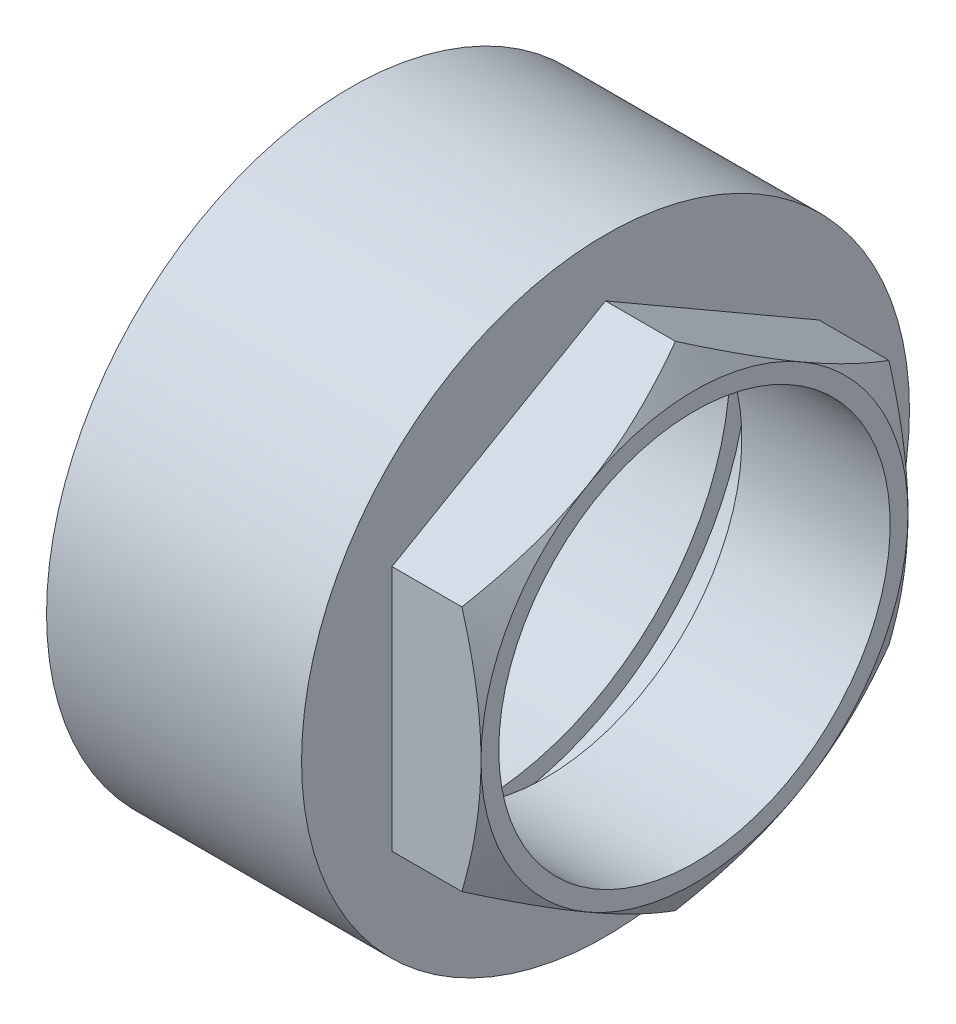
ISO-10303-21;
HEADER;
FILE_DESCRIPTION(('STEP AP214'),'2;1');
FILE_NAME('part.step','',(''),(''),'','','');
FILE_SCHEMA(('AUTOMOTIVE_DESIGN { 1 0 10303 214 1 1 1 1 }'));
ENDSEC;
DATA;
#1=APPLICATION_CONTEXT('core data for automotive mechanical design processes');
#2=APPLICATION_PROTOCOL_DEFINITION('international standard','automotive_design',2000,#1);
#3=PRODUCT_CONTEXT('',#1,'mechanical');
#4=PRODUCT('Part','Part','',(#3));
#5=PRODUCT_RELATED_PRODUCT_CATEGORY('part','',(#4));
#6=PRODUCT_DEFINITION_FORMATION('','',#4);
#7=PRODUCT_DEFINITION_CONTEXT('part definition',#1,'design');
#8=PRODUCT_DEFINITION('design','',#6,#7);
#9=PRODUCT_DEFINITION_SHAPE('','',#8);
#10=(LENGTH_UNIT() NAMED_UNIT(*) SI_UNIT(.MILLI.,.METRE.));
#11=(NAMED_UNIT(*) PLANE_ANGLE_UNIT() SI_UNIT($,.RADIAN.));
#12=(NAMED_UNIT(*) SI_UNIT($,.STERADIAN.) SOLID_ANGLE_UNIT());
#13=UNCERTAINTY_MEASURE_WITH_UNIT(LENGTH_MEASURE(1.E-05),#10,'distance_accuracy_value','');
#14=(GEOMETRIC_REPRESENTATION_CONTEXT(3) GLOBAL_UNCERTAINTY_ASSIGNED_CONTEXT((#13)) GLOBAL_UNIT_ASSIGNED_CONTEXT((#10,
#11,#12)) REPRESENTATION_CONTEXT('',''));
#15=CARTESIAN_POINT('',(0.,0.,0.));
#16=DIRECTION('',(0.,0.,1.));
#17=DIRECTION('',(1.,0.,0.));
#18=AXIS2_PLACEMENT_3D('',#15,#16,#17);
#19=CARTESIAN_POINT('',(0.,0.,0.));
#20=DIRECTION('',(1.,0.,0.));
#21=DIRECTION('',(0.,0.,-1.));
#22=AXIS2_PLACEMENT_3D('',#19,#20,#21);
#23=PLANE('',#22);
#24=CARTESIAN_POINT('',(0.,0.,0.));
#25=DIRECTION('',(1.,0.,0.));
#26=DIRECTION('',(0.,0.,-1.));
#27=AXIS2_PLACEMENT_3D('',#24,#25,#26);
#28=CIRCLE('',#27,25.625);
#29=CARTESIAN_POINT('',(0.,0.,-25.625));
#30=VERTEX_POINT('',#29);
#31=EDGE_CURVE('E133',#30,#30,#28,.T.);
#32=ORIENTED_EDGE('',*,*,#31,.F.);
#33=EDGE_LOOP('',(#32));
#34=FACE_BOUND('',#33,.T.);
#35=CARTESIAN_POINT('',(0.,0.,0.));
#36=DIRECTION('',(-1.,0.,0.));
#37=DIRECTION('',(0.,0.,1.));
#38=AXIS2_PLACEMENT_3D('',#35,#36,#37);
#39=CIRCLE('',#38,21.5);
#40=CARTESIAN_POINT('',(0.,0.,21.5));
#41=VERTEX_POINT('',#40);
#42=EDGE_CURVE('E150',#41,#41,#39,.T.);
#43=ORIENTED_EDGE('',*,*,#42,.F.);
#44=EDGE_LOOP('',(#43));
#45=FACE_BOUND('',#44,.T.);
#46=ADVANCED_FACE('F30',(#34,#45),#23,.F.);
#47=CARTESIAN_POINT('',(29.,20.7846096908265,0.));
#48=DIRECTION('',(1.,0.,0.));
#49=DIRECTION('',(0.,0.,-1.));
#50=AXIS2_PLACEMENT_3D('',#47,#48,#49);
#51=PLANE('',#50);
#52=CARTESIAN_POINT('',(29.,0.,0.));
#53=DIRECTION('',(1.,0.,0.));
#54=DIRECTION('',(0.,0.,-1.));
#55=AXIS2_PLACEMENT_3D('',#52,#53,#54);
#56=CIRCLE('',#55,18.);
#57=CARTESIAN_POINT('',(29.,-15.5884572681199,-9.));
#58=VERTEX_POINT('',#57);
#59=CARTESIAN_POINT('',(29.,0.,-18.));
#60=VERTEX_POINT('',#59);
#61=EDGE_CURVE('E34',#58,#60,#56,.T.);
#62=ORIENTED_EDGE('',*,*,#61,.T.);
#63=CARTESIAN_POINT('',(29.,15.5884572681199,-8.99999999999999));
#64=VERTEX_POINT('',#63);
#65=EDGE_CURVE('E11',#60,#64,#56,.T.);
#66=ORIENTED_EDGE('',*,*,#65,.T.);
#67=CARTESIAN_POINT('',(29.,15.5884572681199,9.));
#68=VERTEX_POINT('',#67);
#69=EDGE_CURVE('E39',#64,#68,#56,.T.);
#70=ORIENTED_EDGE('',*,*,#69,.T.);
#71=CARTESIAN_POINT('',(29.,0.,0.));
#72=DIRECTION('',(-1.,0.,0.));
#73=DIRECTION('',(0.,0.,1.));
#74=AXIS2_PLACEMENT_3D('',#71,#72,#73);
#75=CIRCLE('',#74,18.);
#76=CARTESIAN_POINT('',(29.,0.,18.));
#77=VERTEX_POINT('',#76);
#78=EDGE_CURVE('E110',#77,#68,#75,.T.);
#79=ORIENTED_EDGE('',*,*,#78,.F.);
#80=CARTESIAN_POINT('',(29.,-15.5884572681199,8.99999999999999));
#81=VERTEX_POINT('',#80);
#82=EDGE_CURVE('E267',#77,#81,#56,.T.);
#83=ORIENTED_EDGE('',*,*,#82,.T.);
#84=EDGE_CURVE('E441',#81,#58,#56,.T.);
#85=ORIENTED_EDGE('',*,*,#84,.T.);
#86=EDGE_LOOP('',(#62,#66,#70,#79,#83,#85));
#87=FACE_BOUND('',#86,.T.);
#88=CARTESIAN_POINT('',(29.,0.,0.));
#89=DIRECTION('',(-1.,0.,0.));
#90=DIRECTION('',(0.,0.,1.));
#91=AXIS2_PLACEMENT_3D('',#88,#89,#90);
#92=CIRCLE('',#91,16.5);
#93=CARTESIAN_POINT('',(29.,0.,16.5));
#94=VERTEX_POINT('',#93);
#95=EDGE_CURVE('E272',#94,#94,#92,.T.);
#96=ORIENTED_EDGE('',*,*,#95,.T.);
#97=EDGE_LOOP('',(#96));
#98=FACE_BOUND('',#97,.T.);
#99=ADVANCED_FACE('F147',(#87,#98),#51,.T.);
#100=CARTESIAN_POINT('',(29.,10.3923048454133,-18.));
#101=DIRECTION('',(0.,-0.866025403784439,0.5));
#102=DIRECTION('',(0.,-0.5,-0.866025403784439));
#103=AXIS2_PLACEMENT_3D('',#100,#101,#102);
#104=PLANE('',#103);
#105=CARTESIAN_POINT('',(27.3922381781911,10.3921893753594,-18.0002));
#106=CARTESIAN_POINT('',(27.5241066344369,10.6206079566545,-17.6045674118041));
#107=CARTESIAN_POINT('',(27.6499911097882,10.8499174930169,-17.2073916441644));
#108=CARTESIAN_POINT('',(27.888128763889,11.310375356009,-16.4098552307175));
#109=CARTESIAN_POINT('',(28.0003774593407,11.5415242609305,-16.0094935832795));
#110=CARTESIAN_POINT('',(28.209734702416,12.0061075993295,-15.2048116368224));
#111=CARTESIAN_POINT('',(28.306807426859,12.2395460983593,-14.8004842960602));
#112=CARTESIAN_POINT('',(28.4837282562123,12.7080451523823,-13.9890201311945));
#113=CARTESIAN_POINT('',(28.5635773475793,12.9431056136839,-13.5818834693696));
#114=CARTESIAN_POINT('',(28.7026546971451,13.4088255484441,-12.7752328802672));
#115=CARTESIAN_POINT('',(28.7623432768864,13.6394504469968,-12.3757788384836));
#116=CARTESIAN_POINT('',(28.8624276243306,14.1017570002651,-11.5750403995507));
#117=CARTESIAN_POINT('',(28.9028230206749,14.3334386752352,-11.1737559673198));
#118=CARTESIAN_POINT('',(28.9633010411824,14.7971912077607,-10.370513018847));
#119=CARTESIAN_POINT('',(28.9834078029611,15.0292612730516,-9.96855587484737));
#120=CARTESIAN_POINT('',(29.0028761460026,15.4936156120144,-9.16427056704862));
#121=CARTESIAN_POINT('',(29.0022383682911,15.7258998788456,-8.76194241509821));
#122=CARTESIAN_POINT('',(28.9816664205036,16.1601606713826,-8.00978065868889));
#123=CARTESIAN_POINT('',(28.9642408155994,16.3621681381522,-7.65989346273577));
#124=CARTESIAN_POINT('',(28.9140309314988,16.765701206145,-6.96095368643808));
#125=CARTESIAN_POINT('',(28.8812468722637,16.9672268142278,-6.61190109421242));
#126=CARTESIAN_POINT('',(28.8008889424213,17.3697198122039,-5.91476277202715));
#127=CARTESIAN_POINT('',(28.7533016974352,17.5706865308241,-5.56667820474646));
#128=CARTESIAN_POINT('',(28.6441771234326,17.9716632799777,-4.87216610255866));
#129=CARTESIAN_POINT('',(28.5826398535274,18.1716733145612,-4.5257385606365));
#130=CARTESIAN_POINT('',(28.3755379242914,18.7788295665707,-3.47411308402298));
#131=CARTESIAN_POINT('',(28.2093225320669,19.1842175215698,-2.77196054918801));
#132=CARTESIAN_POINT('',(27.8320818297012,19.9889486858692,-1.37812528618741));
#133=CARTESIAN_POINT('',(27.6211451128723,20.3883021980098,-0.686424712978879));
#134=CARTESIAN_POINT('',(27.3922381781911,20.7847251608804,0.000200000000005904));
#135=B_SPLINE_CURVE_WITH_KNOTS('',3,(#105,#106,#107,#108,#109,#110,#111,#112,#113,#114,#115,
#116,#117,#118,#119,#120,#121,#122,#123,#124,#125,#126,#127,#128,#129,#130,#131,#132,#133,#134),
.UNSPECIFIED.,.F.,.F.,(4,2,2,2,2,2,2,2,2,2,2,2,2,2,4),(0.,1.42650335783821,2.85347447244912,
4.28376471280637,5.71397301377358,7.10888071673007,8.5038152680368,9.89708828642549,
11.2903182514067,12.5031974791544,13.7160593367767,14.9300201888636,16.1439758970578,
18.6253607678546,21.1018751738864),.UNSPECIFIED.);
#136=CARTESIAN_POINT('',(27.3923048454133,10.3923048454133,-18.));
#137=VERTEX_POINT('',#136);
#138=EDGE_CURVE('E239',#137,#64,#135,.T.);
#139=ORIENTED_EDGE('',*,*,#138,.F.);
#140=DIRECTION('',(-1.,0.,0.));
#141=VECTOR('',#140,1.);
#142=CARTESIAN_POINT('',(29.,10.3923048454133,-18.));
#143=LINE('',#142,#141);
#144=CARTESIAN_POINT('',(21.5,10.3923048454133,-18.));
#145=VERTEX_POINT('',#144);
#146=EDGE_CURVE('E247',#137,#145,#143,.T.);
#147=ORIENTED_EDGE('',*,*,#146,.T.);
#148=DIRECTION('',(0.,0.499999999999999,0.866025403784439));
#149=VECTOR('',#148,1.);
#150=CARTESIAN_POINT('',(21.5,10.3923048454133,-18.));
#151=LINE('',#150,#149);
#152=CARTESIAN_POINT('',(21.5,20.7846096908265,0.));
#153=VERTEX_POINT('',#152);
#154=EDGE_CURVE('E233',#145,#153,#151,.T.);
#155=ORIENTED_EDGE('',*,*,#154,.T.);
#156=DIRECTION('',(-1.,0.,0.));
#157=VECTOR('',#156,1.);
#158=CARTESIAN_POINT('',(29.,20.7846096908265,0.));
#159=LINE('',#158,#157);
#160=CARTESIAN_POINT('',(27.3923048454133,20.7846096908265,0.));
#161=VERTEX_POINT('',#160);
#162=EDGE_CURVE('E130',#161,#153,#159,.T.);
#163=ORIENTED_EDGE('',*,*,#162,.F.);
#164=EDGE_CURVE('E205',#64,#161,#135,.T.);
#165=ORIENTED_EDGE('',*,*,#164,.F.);
#166=EDGE_LOOP('',(#139,#147,#155,#163,#165));
#167=FACE_BOUND('',#166,.T.);
#168=ADVANCED_FACE('F213',(#167),#104,.F.);
#169=CARTESIAN_POINT('',(29.,20.7846096908265,0.));
#170=DIRECTION('',(0.,-0.866025403784438,-0.5));
#171=DIRECTION('',(0.,0.5,-0.866025403784439));
#172=AXIS2_PLACEMENT_3D('',#169,#170,#171);
#173=PLANE('',#172);
#174=CARTESIAN_POINT('',(27.3922381781911,20.7847251608804,-0.00019999999999666));
#175=CARTESIAN_POINT('',(27.5241066344369,20.5563065795853,0.395432588195892));
#176=CARTESIAN_POINT('',(27.6499911097882,20.3269970432229,0.792608355835564));
#177=CARTESIAN_POINT('',(27.888128763889,19.8665391802308,1.59014476928247));
#178=CARTESIAN_POINT('',(28.0003774593407,19.6353902753093,1.99050641672051));
#179=CARTESIAN_POINT('',(28.209734702416,19.1708069369103,2.79518836317755));
#180=CARTESIAN_POINT('',(28.306807426859,18.9373684378805,3.19951570393979));
#181=CARTESIAN_POINT('',(28.4837282562123,18.4688693838575,4.01097986880547));
#182=CARTESIAN_POINT('',(28.5635773475793,18.2338089225559,4.41811653063042));
#183=CARTESIAN_POINT('',(28.7026546971451,17.7680889877957,5.22476711973284));
#184=CARTESIAN_POINT('',(28.7623432768864,17.537464089243,5.62422116151642));
#185=CARTESIAN_POINT('',(28.8624276243306,17.0751575359747,6.42495960044929));
#186=CARTESIAN_POINT('',(28.9028230206749,16.8434758610045,6.82624403268017));
#187=CARTESIAN_POINT('',(28.9633010411824,16.3797233284791,7.62948698115295));
#188=CARTESIAN_POINT('',(28.9834078029611,16.1476532631882,8.03144412515262));
#189=CARTESIAN_POINT('',(29.0028761460026,15.6832989242254,8.83572943295137));
#190=CARTESIAN_POINT('',(29.0022383682911,15.4510146573942,9.23805758490178));
#191=CARTESIAN_POINT('',(28.9816664205036,15.0167538648572,9.9902193413111));
#192=CARTESIAN_POINT('',(28.9642408155994,14.8147463980876,10.3401065372642));
#193=CARTESIAN_POINT('',(28.9140309314988,14.4112133300948,11.0390463135619));
#194=CARTESIAN_POINT('',(28.8812468722637,14.209687722012,11.3880989057876));
#195=CARTESIAN_POINT('',(28.8008889424213,13.8071947240359,12.0852372279728));
#196=CARTESIAN_POINT('',(28.7533016974352,13.6062280054157,12.4333217952535));
#197=CARTESIAN_POINT('',(28.6441771234326,13.2052512562621,13.1278338974413));
#198=CARTESIAN_POINT('',(28.5826398535274,13.0052412216786,13.4742614393635));
#199=CARTESIAN_POINT('',(28.3755379242915,12.3980849696691,14.525886915977));
#200=CARTESIAN_POINT('',(28.2093225320669,11.99269701467,15.228039450812));
#201=CARTESIAN_POINT('',(27.8320818297012,11.1879658503706,16.6218747138126));
#202=CARTESIAN_POINT('',(27.6211451128723,10.78861233823,17.3135752870211));
#203=CARTESIAN_POINT('',(27.3922381781911,10.3921893753594,18.0002));
#204=B_SPLINE_CURVE_WITH_KNOTS('',3,(#174,#175,#176,#177,#178,#179,#180,#181,#182,#183,#184,
#185,#186,#187,#188,#189,#190,#191,#192,#193,#194,#195,#196,#197,#198,#199,#200,#201,#202,#203),
.UNSPECIFIED.,.F.,.F.,(4,2,2,2,2,2,2,2,2,2,2,2,2,2,4),(0.,1.42650335783821,2.85347447244912,
4.28376471280637,5.71397301377358,7.10888071673007,8.5038152680368,9.89708828642549,
11.2903182514067,12.5031974791544,13.7160593367767,14.9300201888636,16.1439758970578,
18.6253607678546,21.1018751738864),.UNSPECIFIED.);
#205=EDGE_CURVE('E115',#161,#68,#204,.T.);
#206=ORIENTED_EDGE('',*,*,#205,.F.);
#207=ORIENTED_EDGE('',*,*,#162,.T.);
#208=DIRECTION('',(0.,-0.5,0.866025403784438));
#209=VECTOR('',#208,1.);
#210=CARTESIAN_POINT('',(21.5,20.7846096908265,0.));
#211=LINE('',#210,#209);
#212=CARTESIAN_POINT('',(21.5,10.3923048454133,18.));
#213=VERTEX_POINT('',#212);
#214=EDGE_CURVE('E128',#153,#213,#211,.T.);
#215=ORIENTED_EDGE('',*,*,#214,.T.);
#216=DIRECTION('',(-1.,0.,0.));
#217=VECTOR('',#216,1.);
#218=CARTESIAN_POINT('',(29.,10.3923048454133,18.));
#219=LINE('',#218,#217);
#220=CARTESIAN_POINT('',(27.3923048454133,10.3923048454133,18.));
#221=VERTEX_POINT('',#220);
#222=EDGE_CURVE('E121',#221,#213,#219,.T.);
#223=ORIENTED_EDGE('',*,*,#222,.F.);
#224=EDGE_CURVE('E104',#68,#221,#204,.T.);
#225=ORIENTED_EDGE('',*,*,#224,.F.);
#226=EDGE_LOOP('',(#206,#207,#215,#223,#225));
#227=FACE_BOUND('',#226,.T.);
#228=ADVANCED_FACE('F126',(#227),#173,.F.);
#229=CARTESIAN_POINT('',(29.,10.3923048454133,18.));
#230=DIRECTION('',(0.,0.,-1.));
#231=DIRECTION('',(-1.,0.,0.));
#232=AXIS2_PLACEMENT_3D('',#229,#230,#231);
#233=PLANE('',#232);
#234=CARTESIAN_POINT('',(20.3865193044174,-27.5619239548148,18.));
#235=CARTESIAN_POINT('',(20.5775222951237,-27.1667877315058,18.));
#236=CARTESIAN_POINT('',(20.76753676109,-26.7711739061182,18.));
#237=CARTESIAN_POINT('',(21.145361740967,-25.978890150394,18.));
#238=CARTESIAN_POINT('',(21.3331722306609,-25.5822202085116,18.));
#239=CARTESIAN_POINT('',(21.8930117860161,-24.3903587108182,18.));
#240=CARTESIAN_POINT('',(22.2613866807049,-23.5934439060383,18.));
#241=CARTESIAN_POINT('',(22.9881216788421,-21.9895471419339,18.));
#242=CARTESIAN_POINT('',(23.3464124080854,-21.1825336697993,18.));
#243=CARTESIAN_POINT('',(24.047610550774,-19.5618746110391,18.));
#244=CARTESIAN_POINT('',(24.3905187654445,-18.7482293724554,18.));
#245=CARTESIAN_POINT('',(25.0609225301508,-17.1029123101683,18.));
#246=CARTESIAN_POINT('',(25.388177175781,-16.2711418104043,18.));
#247=CARTESIAN_POINT('',(26.017057075851,-14.597784286177,18.));
#248=CARTESIAN_POINT('',(26.3186794816951,-13.7561961824397,18.));
#249=CARTESIAN_POINT('',(26.8881863228028,-12.0636207961924,18.));
#250=CARTESIAN_POINT('',(27.1561424884024,-11.2126578484076,18.));
#251=CARTESIAN_POINT('',(27.6496277899467,-9.49855213955008,18.));
#252=CARTESIAN_POINT('',(27.8751703291536,-8.6354133192177,18.));
#253=CARTESIAN_POINT('',(28.1734174507343,-7.33140916170395,18.));
#254=CARTESIAN_POINT('',(28.2661706403458,-6.89509921035708,18.));
#255=CARTESIAN_POINT('',(28.4368568243514,-6.01957542081141,18.));
#256=CARTESIAN_POINT('',(28.5147901515749,-5.58036164805689,18.));
#257=CARTESIAN_POINT('',(28.6544549640035,-4.6993249922613,18.));
#258=CARTESIAN_POINT('',(28.7161854541404,-4.25750195067963,18.));
#259=CARTESIAN_POINT('',(28.8222047179834,-3.37175302675203,18.));
#260=CARTESIAN_POINT('',(28.8664934709597,-2.92782714190747,18.));
#261=CARTESIAN_POINT('',(28.936436954341,-2.04133804004202,18.));
#262=CARTESIAN_POINT('',(28.9622082771447,-1.598784082632,18.));
#263=CARTESIAN_POINT('',(28.9949814156095,-0.712983926633318,18.));
#264=CARTESIAN_POINT('',(29.0019835148675,-0.269737738605292,18.));
#265=CARTESIAN_POINT('',(28.997052140406,0.616528728146653,18.));
#266=CARTESIAN_POINT('',(28.9851239048028,1.05954903544431,18.));
#267=CARTESIAN_POINT('',(28.9426284593645,1.9446967341162,18.));
#268=CARTESIAN_POINT('',(28.9120604290307,2.38682408532411,18.));
#269=CARTESIAN_POINT('',(28.81605030069,3.45808110656982,18.));
#270=CARTESIAN_POINT('',(28.7412878237131,4.08639173381696,18.));
#271=CARTESIAN_POINT('',(28.558281546947,5.33809089438755,18.));
#272=CARTESIAN_POINT('',(28.4500327800194,5.96147868341138,18.));
#273=CARTESIAN_POINT('',(28.0804864692942,7.82534534353266,18.));
#274=CARTESIAN_POINT('',(27.7746349264819,9.05709271194061,18.));
#275=CARTESIAN_POINT('',(27.2472455548877,10.8995809919374,18.));
#276=CARTESIAN_POINT('',(27.0574330064655,11.5199484618673,18.));
#277=CARTESIAN_POINT('',(26.6588828056135,12.7546900315391,18.));
#278=CARTESIAN_POINT('',(26.4501434447938,13.3690635846978,18.));
#279=CARTESIAN_POINT('',(26.0181873306204,14.5887549052584,18.));
#280=CARTESIAN_POINT('',(25.7950588597982,15.1941042030674,18.));
#281=CARTESIAN_POINT('',(25.4507056311728,16.0983156250988,18.));
#282=CARTESIAN_POINT('',(25.3343308432211,16.3990354213605,18.));
#283=CARTESIAN_POINT('',(25.0986224398255,16.9993068009233,18.));
#284=CARTESIAN_POINT('',(24.9792888830397,17.298858407248,18.));
#285=CARTESIAN_POINT('',(24.858609470562,17.5978664544007,18.));
#286=B_SPLINE_CURVE_WITH_KNOTS('',3,(#234,#235,#236,#237,#238,#239,#240,#241,#242,#243,#244,
#245,#246,#247,#248,#249,#250,#251,#252,#253,#254,#255,#256,#257,#258,#259,#260,#261,#262,#263,
#264,#265,#266,#267,#268,#269,#270,#271,#272,#273,#274,#275,#276,#277,#278,#279,#280,#281,#282,
#283,#284,#285),.UNSPECIFIED.,.F.,.F.,(4,2,2,2,2,2,2,2,2,2,2,2,2,2,2,2,2,2,2,2,2,2,2,2,2,4),(0.,
1.31663443905649,2.6332833315075,5.26700924472548,7.91580691121445,10.5644664498451,
13.2456434009398,15.9271179315146,18.6027786855858,21.2775924696093,22.6155612790714,
23.9535000364353,25.2915209416894,26.6295434371915,27.9590656257616,29.2885677255708,
30.6177020097832,31.9468948049265,33.8440459909246,35.7414787230295,39.5436531019888,
41.4897689730643,43.4360606814942,45.3713764468858,46.3387197810932,47.3060439528869),.UNSPECIFIED.);
#287=EDGE_CURVE('E107',#221,#77,#286,.F.);
#288=ORIENTED_EDGE('',*,*,#287,.F.);
#289=ORIENTED_EDGE('',*,*,#222,.T.);
#290=DIRECTION('',(0.,-1.,0.));
#291=VECTOR('',#290,1.);
#292=CARTESIAN_POINT('',(21.5,10.3923048454133,18.));
#293=LINE('',#292,#291);
#294=CARTESIAN_POINT('',(21.5,-10.3923048454133,18.));
#295=VERTEX_POINT('',#294);
#296=EDGE_CURVE('E235',#213,#295,#293,.T.);
#297=ORIENTED_EDGE('',*,*,#296,.T.);
#298=DIRECTION('',(-1.,0.,0.));
#299=VECTOR('',#298,1.);
#300=CARTESIAN_POINT('',(29.,-10.3923048454133,18.));
#301=LINE('',#300,#299);
#302=CARTESIAN_POINT('',(27.3923048454133,-10.3923048454133,18.));
#303=VERTEX_POINT('',#302);
#304=EDGE_CURVE('E131',#303,#295,#301,.T.);
#305=ORIENTED_EDGE('',*,*,#304,.F.);
#306=EDGE_CURVE('E124',#77,#303,#286,.F.);
#307=ORIENTED_EDGE('',*,*,#306,.F.);
#308=EDGE_LOOP('',(#288,#289,#297,#305,#307));
#309=FACE_BOUND('',#308,.T.);
#310=ADVANCED_FACE('F119',(#309),#233,.F.);
#311=CARTESIAN_POINT('',(29.,-10.3923048454133,18.));
#312=DIRECTION('',(0.,0.866025403784439,-0.5));
#313=DIRECTION('',(0.,0.5,0.866025403784439));
#314=AXIS2_PLACEMENT_3D('',#311,#312,#313);
#315=PLANE('',#314);
#316=CARTESIAN_POINT('',(27.3922381781911,-10.3921893753594,18.0002));
#317=CARTESIAN_POINT('',(27.5241066344369,-10.6206079566545,17.6045674118041));
#318=CARTESIAN_POINT('',(27.6499911097882,-10.8499174930169,17.2073916441644));
#319=CARTESIAN_POINT('',(27.888128763889,-11.310375356009,16.4098552307175));
#320=CARTESIAN_POINT('',(28.0003774593407,-11.5415242609305,16.0094935832795));
#321=CARTESIAN_POINT('',(28.209734702416,-12.0061075993295,15.2048116368224));
#322=CARTESIAN_POINT('',(28.306807426859,-12.2395460983593,14.8004842960602));
#323=CARTESIAN_POINT('',(28.4837282562123,-12.7080451523823,13.9890201311945));
#324=CARTESIAN_POINT('',(28.5635773475793,-12.9431056136839,13.5818834693696));
#325=CARTESIAN_POINT('',(28.7026546971451,-13.4088255484441,12.7752328802672));
#326=CARTESIAN_POINT('',(28.7623432768864,-13.6394504469968,12.3757788384836));
#327=CARTESIAN_POINT('',(28.8624276243305,-14.1017570002651,11.5750403995507));
#328=CARTESIAN_POINT('',(28.9028230206749,-14.3334386752352,11.1737559673198));
#329=CARTESIAN_POINT('',(28.9633010411824,-14.7971912077607,10.370513018847));
#330=CARTESIAN_POINT('',(28.9834078029611,-15.0292612730516,9.96855587484737));
#331=CARTESIAN_POINT('',(29.0028761460026,-15.4936156120144,9.16427056704862));
#332=CARTESIAN_POINT('',(29.0022383682911,-15.7258998788456,8.76194241509821));
#333=CARTESIAN_POINT('',(28.9816664205036,-16.1601606713826,8.00978065868889));
#334=CARTESIAN_POINT('',(28.9642408155993,-16.3621681381522,7.65989346273577));
#335=CARTESIAN_POINT('',(28.9140309314988,-16.765701206145,6.96095368643808));
#336=CARTESIAN_POINT('',(28.8812468722637,-16.9672268142278,6.61190109421242));
#337=CARTESIAN_POINT('',(28.8008889424213,-17.3697198122039,5.91476277202716));
#338=CARTESIAN_POINT('',(28.7533016974352,-17.5706865308241,5.56667820474646));
#339=CARTESIAN_POINT('',(28.6441771234326,-17.9716632799777,4.87216610255867));
#340=CARTESIAN_POINT('',(28.5826398535274,-18.1716733145612,4.52573856063651));
#341=CARTESIAN_POINT('',(28.3755379242914,-18.7788295665707,3.47411308402299));
#342=CARTESIAN_POINT('',(28.2093225320669,-19.1842175215698,2.77196054918801));
#343=CARTESIAN_POINT('',(27.8320818297012,-19.9889486858692,1.37812528618742));
#344=CARTESIAN_POINT('',(27.6211451128723,-20.3883021980098,0.686424712978882));
#345=CARTESIAN_POINT('',(27.3922381781911,-20.7847251608804,-0.000200000000001138));
#346=B_SPLINE_CURVE_WITH_KNOTS('',3,(#316,#317,#318,#319,#320,#321,#322,#323,#324,#325,#326,
#327,#328,#329,#330,#331,#332,#333,#334,#335,#336,#337,#338,#339,#340,#341,#342,#343,#344,#345),
.UNSPECIFIED.,.F.,.F.,(4,2,2,2,2,2,2,2,2,2,2,2,2,2,4),(0.,1.42650335783821,2.85347447244913,
4.28376471280638,5.71397301377358,7.10888071673008,8.5038152680368,9.8970882864255,
11.2903182514067,12.5031974791544,13.7160593367767,14.9300201888636,16.1439758970578,
18.6253607678546,21.1018751738864),.UNSPECIFIED.);
#347=EDGE_CURVE('E439',#303,#81,#346,.T.);
#348=ORIENTED_EDGE('',*,*,#347,.F.);
#349=ORIENTED_EDGE('',*,*,#304,.T.);
#350=DIRECTION('',(0.,-0.5,-0.866025403784439));
#351=VECTOR('',#350,1.);
#352=CARTESIAN_POINT('',(21.5,-10.3923048454133,18.));
#353=LINE('',#352,#351);
#354=CARTESIAN_POINT('',(21.5,-20.7846096908265,0.));
#355=VERTEX_POINT('',#354);
#356=EDGE_CURVE('E237',#295,#355,#353,.T.);
#357=ORIENTED_EDGE('',*,*,#356,.T.);
#358=DIRECTION('',(-1.,0.,0.));
#359=VECTOR('',#358,1.);
#360=CARTESIAN_POINT('',(29.,-20.7846096908265,0.));
#361=LINE('',#360,#359);
#362=CARTESIAN_POINT('',(27.3923048454133,-20.7846096908265,0.));
#363=VERTEX_POINT('',#362);
#364=EDGE_CURVE('E135',#363,#355,#361,.T.);
#365=ORIENTED_EDGE('',*,*,#364,.F.);
#366=EDGE_CURVE('E192',#81,#363,#346,.T.);
#367=ORIENTED_EDGE('',*,*,#366,.F.);
#368=EDGE_LOOP('',(#348,#349,#357,#365,#367));
#369=FACE_BOUND('',#368,.T.);
#370=ADVANCED_FACE('F258',(#369),#315,.F.);
#371=CARTESIAN_POINT('',(29.,-20.7846096908265,0.));
#372=DIRECTION('',(0.,0.866025403784439,0.5));
#373=DIRECTION('',(0.,-0.5,0.866025403784439));
#374=AXIS2_PLACEMENT_3D('',#371,#372,#373);
#375=PLANE('',#374);
#376=CARTESIAN_POINT('',(27.3922381781911,-20.7847251608804,0.000199999999999972));
#377=CARTESIAN_POINT('',(27.5241066344369,-20.5563065795853,-0.395432588195889));
#378=CARTESIAN_POINT('',(27.6499911097882,-20.3269970432229,-0.792608355835561));
#379=CARTESIAN_POINT('',(27.888128763889,-19.8665391802308,-1.59014476928247));
#380=CARTESIAN_POINT('',(28.0003774593407,-19.6353902753093,-1.99050641672051));
#381=CARTESIAN_POINT('',(28.209734702416,-19.1708069369103,-2.79518836317754));
#382=CARTESIAN_POINT('',(28.306807426859,-18.9373684378805,-3.19951570393978));
#383=CARTESIAN_POINT('',(28.4837282562123,-18.4688693838575,-4.01097986880547));
#384=CARTESIAN_POINT('',(28.5635773475793,-18.2338089225559,-4.41811653063042));
#385=CARTESIAN_POINT('',(28.7026546971451,-17.7680889877957,-5.22476711973284));
#386=CARTESIAN_POINT('',(28.7623432768864,-17.537464089243,-5.62422116151642));
#387=CARTESIAN_POINT('',(28.8624276243305,-17.0751575359747,-6.42495960044928));
#388=CARTESIAN_POINT('',(28.9028230206749,-16.8434758610045,-6.82624403268017));
#389=CARTESIAN_POINT('',(28.9633010411824,-16.3797233284791,-7.62948698115295));
#390=CARTESIAN_POINT('',(28.9834078029611,-16.1476532631882,-8.03144412515262));
#391=CARTESIAN_POINT('',(29.0028761460026,-15.6832989242254,-8.83572943295137));
#392=CARTESIAN_POINT('',(29.0022383682911,-15.4510146573942,-9.23805758490178));
#393=CARTESIAN_POINT('',(28.9816664205036,-15.0167538648572,-9.9902193413111));
#394=CARTESIAN_POINT('',(28.9642408155993,-14.8147463980876,-10.3401065372642));
#395=CARTESIAN_POINT('',(28.9140309314988,-14.4112133300948,-11.0390463135619));
#396=CARTESIAN_POINT('',(28.8812468722637,-14.209687722012,-11.3880989057876));
#397=CARTESIAN_POINT('',(28.8008889424213,-13.8071947240359,-12.0852372279728));
#398=CARTESIAN_POINT('',(28.7533016974352,-13.6062280054157,-12.4333217952535));
#399=CARTESIAN_POINT('',(28.6441771234326,-13.2052512562621,-13.1278338974413));
#400=CARTESIAN_POINT('',(28.5826398535274,-13.0052412216786,-13.4742614393635));
#401=CARTESIAN_POINT('',(28.3755379242914,-12.3980849696691,-14.525886915977));
#402=CARTESIAN_POINT('',(28.2093225320669,-11.99269701467,-15.228039450812));
#403=CARTESIAN_POINT('',(27.8320818297012,-11.1879658503706,-16.6218747138126));
#404=CARTESIAN_POINT('',(27.6211451128723,-10.78861233823,-17.3135752870211));
#405=CARTESIAN_POINT('',(27.3922381781911,-10.3921893753594,-18.0002));
#406=B_SPLINE_CURVE_WITH_KNOTS('',3,(#376,#377,#378,#379,#380,#381,#382,#383,#384,#385,#386,
#387,#388,#389,#390,#391,#392,#393,#394,#395,#396,#397,#398,#399,#400,#401,#402,#403,#404,#405),
.UNSPECIFIED.,.F.,.F.,(4,2,2,2,2,2,2,2,2,2,2,2,2,2,4),(0.,1.42650335783821,2.85347447244912,
4.28376471280637,5.71397301377358,7.10888071673007,8.5038152680368,9.89708828642549,
11.2903182514067,12.5031974791544,13.7160593367767,14.9300201888636,16.1439758970578,
18.6253607678546,21.1018751738864),.UNSPECIFIED.);
#407=EDGE_CURVE('E254',#363,#58,#406,.T.);
#408=ORIENTED_EDGE('',*,*,#407,.F.);
#409=ORIENTED_EDGE('',*,*,#364,.T.);
#410=DIRECTION('',(0.,0.5,-0.866025403784439));
#411=VECTOR('',#410,1.);
#412=CARTESIAN_POINT('',(21.5,-20.7846096908265,0.));
#413=LINE('',#412,#411);
#414=CARTESIAN_POINT('',(21.5,-10.3923048454133,-18.));
#415=VERTEX_POINT('',#414);
#416=EDGE_CURVE('E243',#355,#415,#413,.T.);
#417=ORIENTED_EDGE('',*,*,#416,.T.);
#418=DIRECTION('',(-1.,0.,0.));
#419=VECTOR('',#418,1.);
#420=CARTESIAN_POINT('',(29.,-10.3923048454133,-18.));
#421=LINE('',#420,#419);
#422=CARTESIAN_POINT('',(27.3923048454133,-10.3923048454132,-18.));
#423=VERTEX_POINT('',#422);
#424=EDGE_CURVE('E52',#423,#415,#421,.T.);
#425=ORIENTED_EDGE('',*,*,#424,.F.);
#426=EDGE_CURVE('E168',#58,#423,#406,.T.);
#427=ORIENTED_EDGE('',*,*,#426,.F.);
#428=EDGE_LOOP('',(#408,#409,#417,#425,#427));
#429=FACE_BOUND('',#428,.T.);
#430=ADVANCED_FACE('F227',(#429),#375,.F.);
#431=CARTESIAN_POINT('',(29.,-10.3923048454133,-18.));
#432=DIRECTION('',(0.,0.,1.));
#433=DIRECTION('',(0.,-1.,0.));
#434=AXIS2_PLACEMENT_3D('',#431,#432,#433);
#435=PLANE('',#434);
#436=CARTESIAN_POINT('',(20.3865193044174,-27.5619239548148,-18.));
#437=CARTESIAN_POINT('',(20.5775222951237,-27.1667877315058,-18.));
#438=CARTESIAN_POINT('',(20.76753676109,-26.7711739061182,-18.));
#439=CARTESIAN_POINT('',(21.145361740967,-25.978890150394,-18.));
#440=CARTESIAN_POINT('',(21.3331722306609,-25.5822202085116,-18.));
#441=CARTESIAN_POINT('',(21.8930117860161,-24.3903587108182,-18.));
#442=CARTESIAN_POINT('',(22.2613866807049,-23.5934439060383,-18.));
#443=CARTESIAN_POINT('',(22.9881216788421,-21.9895471419339,-18.));
#444=CARTESIAN_POINT('',(23.3464124080854,-21.1825336697993,-18.));
#445=CARTESIAN_POINT('',(24.047610550774,-19.5618746110391,-18.));
#446=CARTESIAN_POINT('',(24.3905187654445,-18.7482293724554,-18.));
#447=CARTESIAN_POINT('',(25.0609225301508,-17.1029123101683,-18.));
#448=CARTESIAN_POINT('',(25.388177175781,-16.2711418104043,-18.));
#449=CARTESIAN_POINT('',(26.017057075851,-14.597784286177,-18.));
#450=CARTESIAN_POINT('',(26.3186794816951,-13.7561961824397,-18.));
#451=CARTESIAN_POINT('',(26.8881863228028,-12.0636207961924,-18.));
#452=CARTESIAN_POINT('',(27.1561424884024,-11.2126578484076,-18.));
#453=CARTESIAN_POINT('',(27.6496277899467,-9.49855213955007,-18.));
#454=CARTESIAN_POINT('',(27.8751703291537,-8.63541331921769,-18.));
#455=CARTESIAN_POINT('',(28.1734174507343,-7.33140916170394,-18.));
#456=CARTESIAN_POINT('',(28.2661706403458,-6.89509921035707,-18.));
#457=CARTESIAN_POINT('',(28.4368568243514,-6.0195754208114,-18.));
#458=CARTESIAN_POINT('',(28.5147901515749,-5.58036164805689,-18.));
#459=CARTESIAN_POINT('',(28.6544549640035,-4.69932499226129,-18.));
#460=CARTESIAN_POINT('',(28.7161854541404,-4.25750195067962,-18.));
#461=CARTESIAN_POINT('',(28.8222047179834,-3.37175302675201,-18.));
#462=CARTESIAN_POINT('',(28.8664934709597,-2.92782714190746,-18.));
#463=CARTESIAN_POINT('',(28.936436954341,-2.04133804004201,-18.));
#464=CARTESIAN_POINT('',(28.9622082771447,-1.59878408263199,-18.));
#465=CARTESIAN_POINT('',(28.9949814156095,-0.712983926633307,-18.));
#466=CARTESIAN_POINT('',(29.0019835148675,-0.269737738605282,-18.));
#467=CARTESIAN_POINT('',(28.997052140406,0.616528728146664,-18.));
#468=CARTESIAN_POINT('',(28.9851239048028,1.05954903544432,-18.));
#469=CARTESIAN_POINT('',(28.9426284593645,1.94469673411621,-18.));
#470=CARTESIAN_POINT('',(28.9120604290307,2.38682408532412,-18.));
#471=CARTESIAN_POINT('',(28.81605030069,3.45808110656983,-18.));
#472=CARTESIAN_POINT('',(28.7412878237131,4.08639173381696,-18.));
#473=CARTESIAN_POINT('',(28.558281546947,5.33809089438756,-18.));
#474=CARTESIAN_POINT('',(28.4500327800194,5.96147868341139,-18.));
#475=CARTESIAN_POINT('',(28.0804864692942,7.82534534353266,-18.));
#476=CARTESIAN_POINT('',(27.7746349264819,9.05709271194062,-18.));
#477=CARTESIAN_POINT('',(27.2472455548877,10.8995809919375,-18.));
#478=CARTESIAN_POINT('',(27.0574330064655,11.5199484618673,-18.));
#479=CARTESIAN_POINT('',(26.6588828056135,12.7546900315391,-18.));
#480=CARTESIAN_POINT('',(26.4501434447938,13.3690635846978,-18.));
#481=CARTESIAN_POINT('',(26.0181873306204,14.5887549052584,-18.));
#482=CARTESIAN_POINT('',(25.7950588597982,15.1941042030674,-18.));
#483=CARTESIAN_POINT('',(25.4507056311728,16.0983156250989,-18.));
#484=CARTESIAN_POINT('',(25.3343308432211,16.3990354213605,-18.));
#485=CARTESIAN_POINT('',(25.0986224398255,16.9993068009233,-18.));
#486=CARTESIAN_POINT('',(24.9792888830397,17.298858407248,-18.));
#487=CARTESIAN_POINT('',(24.858609470562,17.5978664544007,-18.));
#488=B_SPLINE_CURVE_WITH_KNOTS('',3,(#436,#437,#438,#439,#440,#441,#442,#443,#444,#445,#446,
#447,#448,#449,#450,#451,#452,#453,#454,#455,#456,#457,#458,#459,#460,#461,#462,#463,#464,#465,
#466,#467,#468,#469,#470,#471,#472,#473,#474,#475,#476,#477,#478,#479,#480,#481,#482,#483,#484,
#485,#486,#487),.UNSPECIFIED.,.F.,.F.,(4,2,2,2,2,2,2,2,2,2,2,2,2,2,2,2,2,2,2,2,2,2,2,2,2,4),(0.,
1.31663443905649,2.6332833315075,5.26700924472548,7.91580691121445,10.5644664498451,
13.2456434009398,15.9271179315146,18.6027786855858,21.2775924696093,22.6155612790714,
23.9535000364353,25.2915209416894,26.6295434371915,27.9590656257616,29.2885677255708,
30.6177020097832,31.9468948049265,33.8440459909246,35.7414787230295,39.5436531019888,
41.4897689730643,43.4360606814942,45.3713764468858,46.3387197810932,47.3060439528869),.UNSPECIFIED.);
#489=EDGE_CURVE('E167',#423,#60,#488,.T.);
#490=ORIENTED_EDGE('',*,*,#489,.F.);
#491=ORIENTED_EDGE('',*,*,#424,.T.);
#492=DIRECTION('',(0.,1.,0.));
#493=VECTOR('',#492,1.);
#494=CARTESIAN_POINT('',(21.5,-10.3923048454133,-18.));
#495=LINE('',#494,#493);
#496=EDGE_CURVE('E245',#415,#145,#495,.T.);
#497=ORIENTED_EDGE('',*,*,#496,.T.);
#498=ORIENTED_EDGE('',*,*,#146,.F.);
#499=EDGE_CURVE('E154',#60,#137,#488,.T.);
#500=ORIENTED_EDGE('',*,*,#499,.F.);
#501=EDGE_LOOP('',(#490,#491,#497,#498,#500));
#502=FACE_BOUND('',#501,.T.);
#503=ADVANCED_FACE('F174',(#502),#435,.F.);
#504=CARTESIAN_POINT('',(21.5,0.,0.));
#505=DIRECTION('',(1.,0.,0.));
#506=DIRECTION('',(0.,0.,-1.));
#507=AXIS2_PLACEMENT_3D('',#504,#505,#506);
#508=PLANE('',#507);
#509=CARTESIAN_POINT('',(21.5,0.,0.));
#510=DIRECTION('',(1.,0.,0.));
#511=DIRECTION('',(0.,0.,-1.));
#512=AXIS2_PLACEMENT_3D('',#509,#510,#511);
#513=CIRCLE('',#512,25.625);
#514=CARTESIAN_POINT('',(21.5,0.,-25.625));
#515=VERTEX_POINT('',#514);
#516=EDGE_CURVE('E139',#515,#515,#513,.T.);
#517=ORIENTED_EDGE('',*,*,#516,.T.);
#518=EDGE_LOOP('',(#517));
#519=FACE_BOUND('',#518,.T.);
#520=ORIENTED_EDGE('',*,*,#214,.F.);
#521=ORIENTED_EDGE('',*,*,#154,.F.);
#522=ORIENTED_EDGE('',*,*,#496,.F.);
#523=ORIENTED_EDGE('',*,*,#416,.F.);
#524=ORIENTED_EDGE('',*,*,#356,.F.);
#525=ORIENTED_EDGE('',*,*,#296,.F.);
#526=EDGE_LOOP('',(#520,#521,#522,#523,#524,#525));
#527=FACE_BOUND('',#526,.T.);
#528=ADVANCED_FACE('F219',(#519,#527),#508,.T.);
#529=CARTESIAN_POINT('',(21.5,0.,0.));
#530=DIRECTION('',(-1.,0.,0.));
#531=DIRECTION('',(0.,0.,1.));
#532=AXIS2_PLACEMENT_3D('',#529,#530,#531);
#533=CYLINDRICAL_SURFACE('',#532,25.625);
#534=ORIENTED_EDGE('',*,*,#516,.F.);
#535=EDGE_LOOP('',(#534));
#536=FACE_BOUND('',#535,.T.);
#537=ORIENTED_EDGE('',*,*,#31,.T.);
#538=EDGE_LOOP('',(#537));
#539=FACE_BOUND('',#538,.T.);
#540=ADVANCED_FACE('F32',(#536,#539),#533,.T.);
#541=CARTESIAN_POINT('',(27.3923048454133,0.,0.));
#542=DIRECTION('',(-1.,0.,0.));
#543=DIRECTION('',(0.,0.,1.));
#544=AXIS2_PLACEMENT_3D('',#541,#542,#543);
#545=CONICAL_SURFACE('',#544,20.7846096908265,1.0471975511966);
#546=ORIENTED_EDGE('',*,*,#426,.T.);
#547=ORIENTED_EDGE('',*,*,#489,.T.);
#548=ORIENTED_EDGE('',*,*,#61,.F.);
#549=EDGE_LOOP('',(#546,#547,#548));
#550=FACE_BOUND('',#549,.T.);
#551=ADVANCED_FACE('F184',(#550),#545,.T.);
#552=ORIENTED_EDGE('',*,*,#366,.T.);
#553=ORIENTED_EDGE('',*,*,#407,.T.);
#554=ORIENTED_EDGE('',*,*,#84,.F.);
#555=EDGE_LOOP('',(#552,#553,#554));
#556=FACE_BOUND('',#555,.T.);
#557=ADVANCED_FACE('F367',(#556),#545,.T.);
#558=ORIENTED_EDGE('',*,*,#306,.T.);
#559=ORIENTED_EDGE('',*,*,#347,.T.);
#560=ORIENTED_EDGE('',*,*,#82,.F.);
#561=EDGE_LOOP('',(#558,#559,#560));
#562=FACE_BOUND('',#561,.T.);
#563=ADVANCED_FACE('F359',(#562),#545,.T.);
#564=ORIENTED_EDGE('',*,*,#224,.T.);
#565=ORIENTED_EDGE('',*,*,#287,.T.);
#566=ORIENTED_EDGE('',*,*,#78,.T.);
#567=EDGE_LOOP('',(#564,#565,#566));
#568=FACE_BOUND('',#567,.T.);
#569=ADVANCED_FACE('F106',(#568),#545,.T.);
#570=ORIENTED_EDGE('',*,*,#164,.T.);
#571=ORIENTED_EDGE('',*,*,#205,.T.);
#572=ORIENTED_EDGE('',*,*,#69,.F.);
#573=EDGE_LOOP('',(#570,#571,#572));
#574=FACE_BOUND('',#573,.T.);
#575=ADVANCED_FACE('F182',(#574),#545,.T.);
#576=ORIENTED_EDGE('',*,*,#138,.T.);
#577=ORIENTED_EDGE('',*,*,#65,.F.);
#578=ORIENTED_EDGE('',*,*,#499,.T.);
#579=EDGE_LOOP('',(#576,#577,#578));
#580=FACE_BOUND('',#579,.T.);
#581=ADVANCED_FACE('F177',(#580),#545,.T.);
#582=CARTESIAN_POINT('',(0.,0.,0.));
#583=DIRECTION('',(-1.,0.,0.));
#584=DIRECTION('',(0.,0.,1.));
#585=AXIS2_PLACEMENT_3D('',#582,#583,#584);
#586=CYLINDRICAL_SURFACE('',#585,21.5);
#587=ORIENTED_EDGE('',*,*,#42,.T.);
#588=EDGE_LOOP('',(#587));
#589=FACE_BOUND('',#588,.T.);
#590=CARTESIAN_POINT('',(10.5,0.,0.));
#591=DIRECTION('',(-1.,0.,0.));
#592=DIRECTION('',(0.,0.,1.));
#593=AXIS2_PLACEMENT_3D('',#590,#591,#592);
#594=CIRCLE('',#593,21.5);
#595=CARTESIAN_POINT('',(10.5,0.,21.5));
#596=VERTEX_POINT('',#595);
#597=EDGE_CURVE('E152',#596,#596,#594,.T.);
#598=ORIENTED_EDGE('',*,*,#597,.F.);
#599=EDGE_LOOP('',(#598));
#600=FACE_BOUND('',#599,.T.);
#601=ADVANCED_FACE('F181',(#589,#600),#586,.F.);
#602=CARTESIAN_POINT('',(10.5,21.5,0.));
#603=DIRECTION('',(1.,0.,0.));
#604=DIRECTION('',(0.,0.,-1.));
#605=AXIS2_PLACEMENT_3D('',#602,#603,#604);
#606=PLANE('',#605);
#607=ORIENTED_EDGE('',*,*,#597,.T.);
#608=EDGE_LOOP('',(#607));
#609=FACE_BOUND('',#608,.T.);
#610=CARTESIAN_POINT('',(10.5,0.,0.));
#611=DIRECTION('',(-1.,0.,0.));
#612=DIRECTION('',(0.,0.,1.));
#613=AXIS2_PLACEMENT_3D('',#610,#611,#612);
#614=CIRCLE('',#613,23.);
#615=CARTESIAN_POINT('',(10.5,0.,23.));
#616=VERTEX_POINT('',#615);
#617=EDGE_CURVE('E157',#616,#616,#614,.T.);
#618=ORIENTED_EDGE('',*,*,#617,.F.);
#619=EDGE_LOOP('',(#618));
#620=FACE_BOUND('',#619,.T.);
#621=ADVANCED_FACE('F287',(#609,#620),#606,.T.);
#622=CARTESIAN_POINT('',(0.,0.,0.));
#623=DIRECTION('',(-1.,0.,0.));
#624=DIRECTION('',(0.,0.,1.));
#625=AXIS2_PLACEMENT_3D('',#622,#623,#624);
#626=CYLINDRICAL_SURFACE('',#625,23.);
#627=ORIENTED_EDGE('',*,*,#617,.T.);
#628=EDGE_LOOP('',(#627));
#629=FACE_BOUND('',#628,.T.);
#630=CARTESIAN_POINT('',(16.5,0.,0.));
#631=DIRECTION('',(-1.,0.,0.));
#632=DIRECTION('',(0.,0.,1.));
#633=AXIS2_PLACEMENT_3D('',#630,#631,#632);
#634=CIRCLE('',#633,23.);
#635=CARTESIAN_POINT('',(16.5,0.,23.));
#636=VERTEX_POINT('',#635);
#637=EDGE_CURVE('E277',#636,#636,#634,.T.);
#638=ORIENTED_EDGE('',*,*,#637,.F.);
#639=EDGE_LOOP('',(#638));
#640=FACE_BOUND('',#639,.T.);
#641=ADVANCED_FACE('F284',(#629,#640),#626,.F.);
#642=CARTESIAN_POINT('',(16.5,23.,0.));
#643=DIRECTION('',(-1.,0.,0.));
#644=DIRECTION('',(0.,0.,1.));
#645=AXIS2_PLACEMENT_3D('',#642,#643,#644);
#646=PLANE('',#645);
#647=ORIENTED_EDGE('',*,*,#637,.T.);
#648=EDGE_LOOP('',(#647));
#649=FACE_BOUND('',#648,.T.);
#650=CARTESIAN_POINT('',(16.5,0.,0.));
#651=DIRECTION('',(-1.,0.,0.));
#652=DIRECTION('',(0.,0.,1.));
#653=AXIS2_PLACEMENT_3D('',#650,#651,#652);
#654=CIRCLE('',#653,16.5);
#655=CARTESIAN_POINT('',(16.5,0.,16.5));
#656=VERTEX_POINT('',#655);
#657=EDGE_CURVE('E274',#656,#656,#654,.T.);
#658=ORIENTED_EDGE('',*,*,#657,.F.);
#659=EDGE_LOOP('',(#658));
#660=FACE_BOUND('',#659,.T.);
#661=ADVANCED_FACE('F294',(#649,#660),#646,.T.);
#662=CARTESIAN_POINT('',(0.,0.,0.));
#663=DIRECTION('',(-1.,0.,0.));
#664=DIRECTION('',(0.,0.,1.));
#665=AXIS2_PLACEMENT_3D('',#662,#663,#664);
#666=CYLINDRICAL_SURFACE('',#665,16.5);
#667=ORIENTED_EDGE('',*,*,#657,.T.);
#668=EDGE_LOOP('',(#667));
#669=FACE_BOUND('',#668,.T.);
#670=ORIENTED_EDGE('',*,*,#95,.F.);
#671=EDGE_LOOP('',(#670));
#672=FACE_BOUND('',#671,.T.);
#673=ADVANCED_FACE('F299',(#669,#672),#666,.F.);
#674=CLOSED_SHELL('',(#46,#99,#168,#228,#310,#370,#430,#503,#528,#540,#551,#557,#563,#569,#575,
#581,#601,#621,#641,#661,#673));
#675=MANIFOLD_SOLID_BREP('B2',#674);
#676=ADVANCED_BREP_SHAPE_REPRESENTATION('',(#18,#675),#14);
#677=SHAPE_DEFINITION_REPRESENTATION(#9,#676);
ENDSEC;
END-ISO-10303-21;
